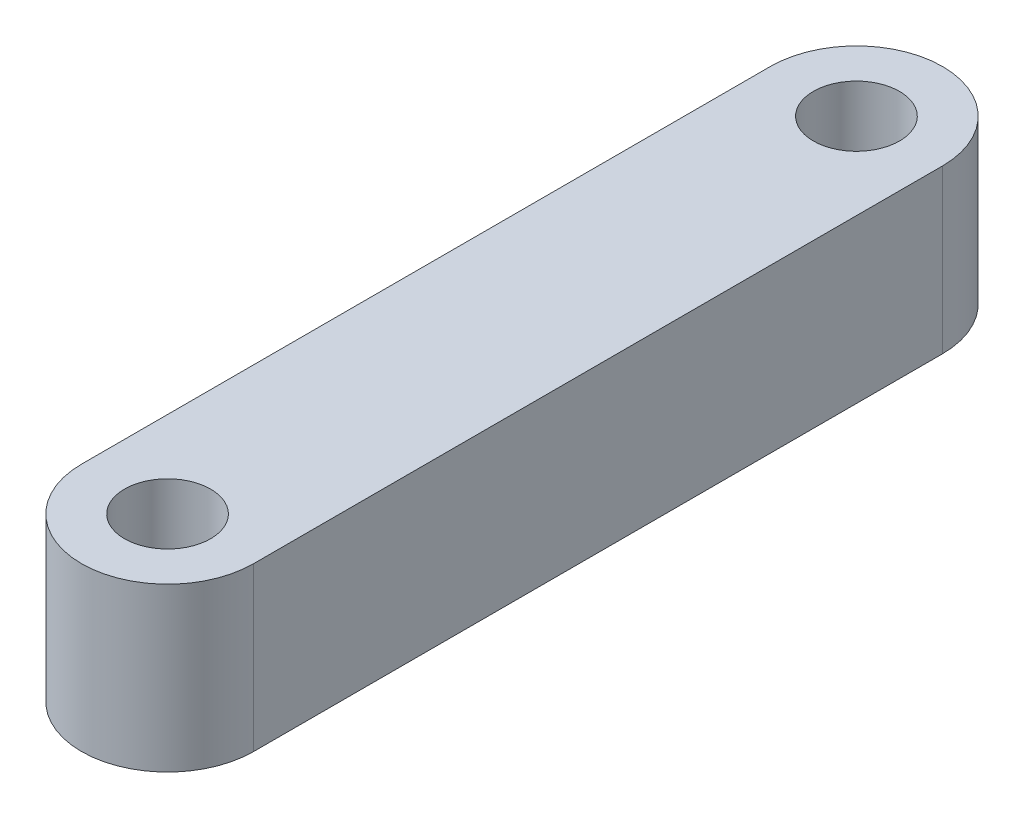
ISO-10303-21;
HEADER;
FILE_DESCRIPTION(('STEP AP214'),'2;1');
FILE_NAME('part.step','',(''),(''),'','','');
FILE_SCHEMA(('AUTOMOTIVE_DESIGN { 1 0 10303 214 1 1 1 1 }'));
ENDSEC;
DATA;
#1=APPLICATION_CONTEXT('core data for automotive mechanical design processes');
#2=APPLICATION_PROTOCOL_DEFINITION('international standard','automotive_design',2000,#1);
#3=PRODUCT_CONTEXT('',#1,'mechanical');
#4=PRODUCT('Part','Part','',(#3));
#5=PRODUCT_RELATED_PRODUCT_CATEGORY('part','',(#4));
#6=PRODUCT_DEFINITION_FORMATION('','',#4);
#7=PRODUCT_DEFINITION_CONTEXT('part definition',#1,'design');
#8=PRODUCT_DEFINITION('design','',#6,#7);
#9=PRODUCT_DEFINITION_SHAPE('','',#8);
#10=(LENGTH_UNIT() NAMED_UNIT(*) SI_UNIT(.MILLI.,.METRE.));
#11=(NAMED_UNIT(*) PLANE_ANGLE_UNIT() SI_UNIT($,.RADIAN.));
#12=(NAMED_UNIT(*) SI_UNIT($,.STERADIAN.) SOLID_ANGLE_UNIT());
#13=UNCERTAINTY_MEASURE_WITH_UNIT(LENGTH_MEASURE(1.E-05),#10,'distance_accuracy_value','');
#14=(GEOMETRIC_REPRESENTATION_CONTEXT(3) GLOBAL_UNCERTAINTY_ASSIGNED_CONTEXT((#13)) GLOBAL_UNIT_ASSIGNED_CONTEXT((#10,
#11,#12)) REPRESENTATION_CONTEXT('',''));
#15=CARTESIAN_POINT('',(0.,0.,0.));
#16=DIRECTION('',(0.,0.,1.));
#17=DIRECTION('',(1.,0.,0.));
#18=AXIS2_PLACEMENT_3D('',#15,#16,#17);
#19=CARTESIAN_POINT('',(0.,6.,-25.4));
#20=DIRECTION('',(0.,1.,0.));
#21=DIRECTION('',(0.,0.,1.));
#22=AXIS2_PLACEMENT_3D('',#19,#20,#21);
#23=PLANE('',#22);
#24=CARTESIAN_POINT('',(0.,6.,0.));
#25=DIRECTION('',(0.,1.,0.));
#26=DIRECTION('',(0.,0.,1.));
#27=AXIS2_PLACEMENT_3D('',#24,#25,#26);
#28=CIRCLE('',#27,1.5875);
#29=CARTESIAN_POINT('',(0.,6.,1.5875));
#30=VERTEX_POINT('',#29);
#31=EDGE_CURVE('E116',#30,#30,#28,.T.);
#32=ORIENTED_EDGE('',*,*,#31,.F.);
#33=EDGE_LOOP('',(#32));
#34=FACE_BOUND('',#33,.T.);
#35=CARTESIAN_POINT('',(0.,6.,-25.4));
#36=DIRECTION('',(0.,1.,0.));
#37=DIRECTION('',(0.,0.,1.));
#38=AXIS2_PLACEMENT_3D('',#35,#36,#37);
#39=CIRCLE('',#38,3.17500000000001);
#40=CARTESIAN_POINT('',(3.175,6.,-25.3999997989143));
#41=VERTEX_POINT('',#40);
#42=CARTESIAN_POINT('',(-3.175,6.,-25.3999997989143));
#43=VERTEX_POINT('',#42);
#44=EDGE_CURVE('E96',#41,#43,#39,.T.);
#45=ORIENTED_EDGE('',*,*,#44,.T.);
#46=DIRECTION('',(0.,0.,1.));
#47=VECTOR('',#46,1.);
#48=CARTESIAN_POINT('',(-3.175,6.,-25.3999997989143));
#49=LINE('',#48,#47);
#50=CARTESIAN_POINT('',(-3.175,6.,-2.01078100547619E-07));
#51=VERTEX_POINT('',#50);
#52=EDGE_CURVE('E91',#43,#51,#49,.T.);
#53=ORIENTED_EDGE('',*,*,#52,.T.);
#54=CARTESIAN_POINT('',(0.,6.,0.));
#55=DIRECTION('',(0.,1.,0.));
#56=DIRECTION('',(0.,0.,1.));
#57=AXIS2_PLACEMENT_3D('',#54,#55,#56);
#58=CIRCLE('',#57,3.17500000000001);
#59=CARTESIAN_POINT('',(3.175,6.,-2.0107809899904E-07));
#60=VERTEX_POINT('',#59);
#61=EDGE_CURVE('E94',#51,#60,#58,.T.);
#62=ORIENTED_EDGE('',*,*,#61,.T.);
#63=DIRECTION('',(0.,0.,-1.));
#64=VECTOR('',#63,1.);
#65=CARTESIAN_POINT('',(3.175,6.,-25.3999997989143));
#66=LINE('',#65,#64);
#67=EDGE_CURVE('E61',#60,#41,#66,.T.);
#68=ORIENTED_EDGE('',*,*,#67,.T.);
#69=EDGE_LOOP('',(#45,#53,#62,#68));
#70=FACE_BOUND('',#69,.T.);
#71=CARTESIAN_POINT('',(0.,6.,-25.4));
#72=DIRECTION('',(0.,1.,0.));
#73=DIRECTION('',(0.,0.,1.));
#74=AXIS2_PLACEMENT_3D('',#71,#72,#73);
#75=CIRCLE('',#74,1.5875);
#76=CARTESIAN_POINT('',(0.,6.,-23.8125));
#77=VERTEX_POINT('',#76);
#78=EDGE_CURVE('E138',#77,#77,#75,.T.);
#79=ORIENTED_EDGE('',*,*,#78,.F.);
#80=EDGE_LOOP('',(#79));
#81=FACE_BOUND('',#80,.T.);
#82=ADVANCED_FACE('F43',(#34,#70,#81),#23,.T.);
#83=CARTESIAN_POINT('',(0.,0.,-25.4));
#84=DIRECTION('',(0.,1.,0.));
#85=DIRECTION('',(0.,0.,1.));
#86=AXIS2_PLACEMENT_3D('',#83,#84,#85);
#87=PLANE('',#86);
#88=CARTESIAN_POINT('',(0.,0.,-25.4));
#89=DIRECTION('',(0.,1.,0.));
#90=DIRECTION('',(0.,0.,1.));
#91=AXIS2_PLACEMENT_3D('',#88,#89,#90);
#92=CIRCLE('',#91,3.17500000000001);
#93=CARTESIAN_POINT('',(3.175,0.,-25.3999997989143));
#94=VERTEX_POINT('',#93);
#95=CARTESIAN_POINT('',(-3.175,0.,-25.3999997989143));
#96=VERTEX_POINT('',#95);
#97=EDGE_CURVE('E112',#94,#96,#92,.T.);
#98=ORIENTED_EDGE('',*,*,#97,.F.);
#99=DIRECTION('',(0.,0.,-1.));
#100=VECTOR('',#99,1.);
#101=CARTESIAN_POINT('',(3.175,0.,-25.3999997989143));
#102=LINE('',#101,#100);
#103=CARTESIAN_POINT('',(3.175,0.,-2.0107809899904E-07));
#104=VERTEX_POINT('',#103);
#105=EDGE_CURVE('E84',#104,#94,#102,.T.);
#106=ORIENTED_EDGE('',*,*,#105,.F.);
#107=CARTESIAN_POINT('',(0.,0.,0.));
#108=DIRECTION('',(0.,1.,0.));
#109=DIRECTION('',(0.,0.,1.));
#110=AXIS2_PLACEMENT_3D('',#107,#108,#109);
#111=CIRCLE('',#110,3.17500000000001);
#112=CARTESIAN_POINT('',(-3.175,0.,-2.01078100547619E-07));
#113=VERTEX_POINT('',#112);
#114=EDGE_CURVE('E78',#113,#104,#111,.T.);
#115=ORIENTED_EDGE('',*,*,#114,.F.);
#116=DIRECTION('',(0.,0.,1.));
#117=VECTOR('',#116,1.);
#118=CARTESIAN_POINT('',(-3.175,0.,-25.3999997989143));
#119=LINE('',#118,#117);
#120=EDGE_CURVE('E101',#96,#113,#119,.T.);
#121=ORIENTED_EDGE('',*,*,#120,.F.);
#122=EDGE_LOOP('',(#98,#106,#115,#121));
#123=FACE_BOUND('',#122,.T.);
#124=CARTESIAN_POINT('',(0.,0.,0.));
#125=DIRECTION('',(0.,1.,0.));
#126=DIRECTION('',(0.,0.,1.));
#127=AXIS2_PLACEMENT_3D('',#124,#125,#126);
#128=CIRCLE('',#127,1.5875);
#129=CARTESIAN_POINT('',(0.,0.,1.5875));
#130=VERTEX_POINT('',#129);
#131=EDGE_CURVE('E134',#130,#130,#128,.T.);
#132=ORIENTED_EDGE('',*,*,#131,.T.);
#133=EDGE_LOOP('',(#132));
#134=FACE_BOUND('',#133,.T.);
#135=CARTESIAN_POINT('',(0.,0.,-25.4));
#136=DIRECTION('',(0.,1.,0.));
#137=DIRECTION('',(0.,0.,1.));
#138=AXIS2_PLACEMENT_3D('',#135,#136,#137);
#139=CIRCLE('',#138,1.5875);
#140=CARTESIAN_POINT('',(0.,0.,-23.8125));
#141=VERTEX_POINT('',#140);
#142=EDGE_CURVE('E142',#141,#141,#139,.T.);
#143=ORIENTED_EDGE('',*,*,#142,.T.);
#144=EDGE_LOOP('',(#143));
#145=FACE_BOUND('',#144,.T.);
#146=ADVANCED_FACE('F129',(#123,#134,#145),#87,.F.);
#147=CARTESIAN_POINT('',(0.,6.,-25.4));
#148=DIRECTION('',(0.,-1.,0.));
#149=DIRECTION('',(0.,0.,-1.));
#150=AXIS2_PLACEMENT_3D('',#147,#148,#149);
#151=CYLINDRICAL_SURFACE('',#150,3.17500000000001);
#152=ORIENTED_EDGE('',*,*,#97,.T.);
#153=DIRECTION('',(0.,-1.,0.));
#154=VECTOR('',#153,1.);
#155=CARTESIAN_POINT('',(-3.175,6.,-25.3999997989143));
#156=LINE('',#155,#154);
#157=EDGE_CURVE('E11',#43,#96,#156,.T.);
#158=ORIENTED_EDGE('',*,*,#157,.F.);
#159=ORIENTED_EDGE('',*,*,#44,.F.);
#160=DIRECTION('',(0.,-1.,0.));
#161=VECTOR('',#160,1.);
#162=CARTESIAN_POINT('',(3.175,6.,-25.3999997989143));
#163=LINE('',#162,#161);
#164=EDGE_CURVE('E108',#41,#94,#163,.T.);
#165=ORIENTED_EDGE('',*,*,#164,.T.);
#166=EDGE_LOOP('',(#152,#158,#159,#165));
#167=FACE_BOUND('',#166,.T.);
#168=ADVANCED_FACE('F45',(#167),#151,.T.);
#169=CARTESIAN_POINT('',(-3.175,6.,-25.3999997989143));
#170=DIRECTION('',(1.,0.,0.));
#171=DIRECTION('',(0.,0.,-1.));
#172=AXIS2_PLACEMENT_3D('',#169,#170,#171);
#173=PLANE('',#172);
#174=ORIENTED_EDGE('',*,*,#120,.T.);
#175=DIRECTION('',(0.,-1.,0.));
#176=VECTOR('',#175,1.);
#177=CARTESIAN_POINT('',(-3.175,6.,-2.01078100547619E-07));
#178=LINE('',#177,#176);
#179=EDGE_CURVE('E53',#51,#113,#178,.T.);
#180=ORIENTED_EDGE('',*,*,#179,.F.);
#181=ORIENTED_EDGE('',*,*,#52,.F.);
#182=ORIENTED_EDGE('',*,*,#157,.T.);
#183=EDGE_LOOP('',(#174,#180,#181,#182));
#184=FACE_BOUND('',#183,.T.);
#185=ADVANCED_FACE('F100',(#184),#173,.F.);
#186=CARTESIAN_POINT('',(0.,6.,0.));
#187=DIRECTION('',(0.,-1.,0.));
#188=DIRECTION('',(0.,0.,-1.));
#189=AXIS2_PLACEMENT_3D('',#186,#187,#188);
#190=CYLINDRICAL_SURFACE('',#189,3.17500000000001);
#191=ORIENTED_EDGE('',*,*,#114,.T.);
#192=DIRECTION('',(0.,-1.,0.));
#193=VECTOR('',#192,1.);
#194=CARTESIAN_POINT('',(3.175,6.,-2.0107809899904E-07));
#195=LINE('',#194,#193);
#196=EDGE_CURVE('E103',#60,#104,#195,.T.);
#197=ORIENTED_EDGE('',*,*,#196,.F.);
#198=ORIENTED_EDGE('',*,*,#61,.F.);
#199=ORIENTED_EDGE('',*,*,#179,.T.);
#200=EDGE_LOOP('',(#191,#197,#198,#199));
#201=FACE_BOUND('',#200,.T.);
#202=ADVANCED_FACE('F104',(#201),#190,.T.);
#203=CARTESIAN_POINT('',(3.175,6.,-25.3999997989143));
#204=DIRECTION('',(-1.,0.,0.));
#205=DIRECTION('',(0.,0.,1.));
#206=AXIS2_PLACEMENT_3D('',#203,#204,#205);
#207=PLANE('',#206);
#208=ORIENTED_EDGE('',*,*,#105,.T.);
#209=ORIENTED_EDGE('',*,*,#164,.F.);
#210=ORIENTED_EDGE('',*,*,#67,.F.);
#211=ORIENTED_EDGE('',*,*,#196,.T.);
#212=EDGE_LOOP('',(#208,#209,#210,#211));
#213=FACE_BOUND('',#212,.T.);
#214=ADVANCED_FACE('F126',(#213),#207,.F.);
#215=CARTESIAN_POINT('',(0.,6.,0.));
#216=DIRECTION('',(0.,-1.,0.));
#217=DIRECTION('',(0.,0.,-1.));
#218=AXIS2_PLACEMENT_3D('',#215,#216,#217);
#219=CYLINDRICAL_SURFACE('',#218,1.5875);
#220=ORIENTED_EDGE('',*,*,#31,.T.);
#221=EDGE_LOOP('',(#220));
#222=FACE_BOUND('',#221,.T.);
#223=ORIENTED_EDGE('',*,*,#131,.F.);
#224=EDGE_LOOP('',(#223));
#225=FACE_BOUND('',#224,.T.);
#226=ADVANCED_FACE('F161',(#222,#225),#219,.F.);
#227=CARTESIAN_POINT('',(0.,6.,-25.4));
#228=DIRECTION('',(0.,-1.,0.));
#229=DIRECTION('',(0.,0.,-1.));
#230=AXIS2_PLACEMENT_3D('',#227,#228,#229);
#231=CYLINDRICAL_SURFACE('',#230,1.5875);
#232=ORIENTED_EDGE('',*,*,#78,.T.);
#233=EDGE_LOOP('',(#232));
#234=FACE_BOUND('',#233,.T.);
#235=ORIENTED_EDGE('',*,*,#142,.F.);
#236=EDGE_LOOP('',(#235));
#237=FACE_BOUND('',#236,.T.);
#238=ADVANCED_FACE('F150',(#234,#237),#231,.F.);
#239=CLOSED_SHELL('',(#82,#146,#168,#185,#202,#214,#226,#238));
#240=MANIFOLD_SOLID_BREP('B2',#239);
#241=ADVANCED_BREP_SHAPE_REPRESENTATION('',(#18,#240),#14);
#242=SHAPE_DEFINITION_REPRESENTATION(#9,#241);
ENDSEC;
END-ISO-10303-21;
